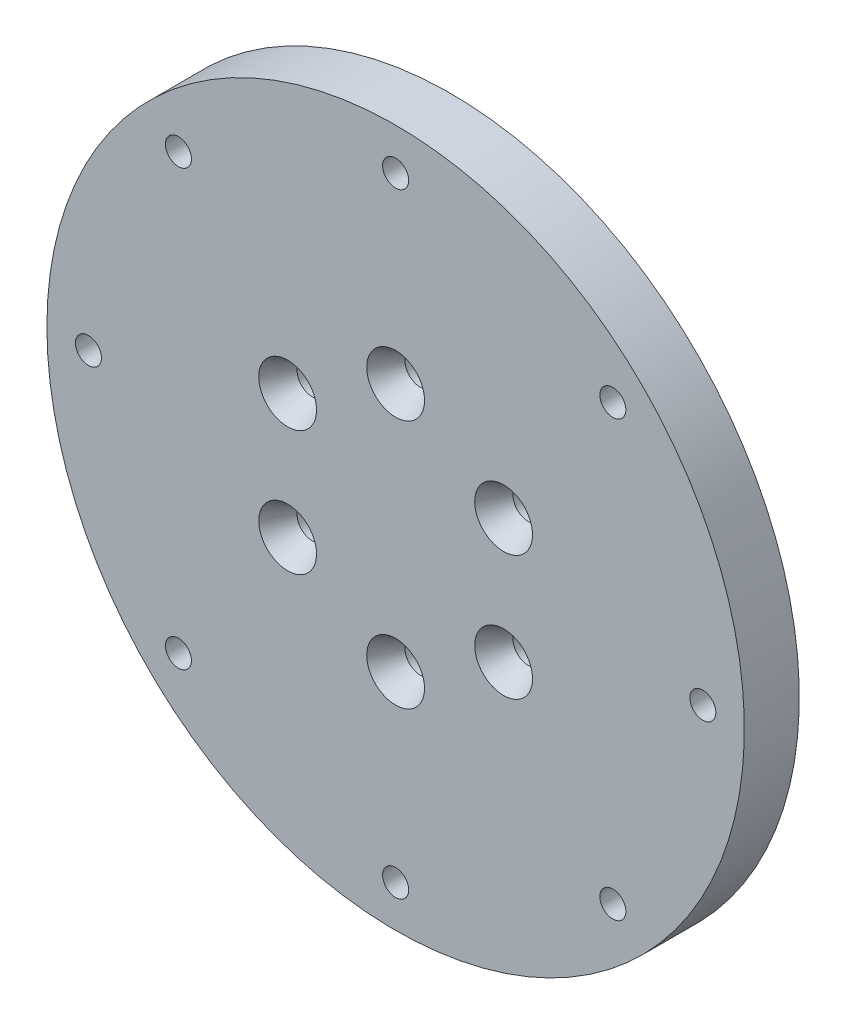
ISO-10303-21;
HEADER;
FILE_DESCRIPTION(('STEP AP214'),'2;1');
FILE_NAME('part.step','',(''),(''),'','','');
FILE_SCHEMA(('AUTOMOTIVE_DESIGN { 1 0 10303 214 1 1 1 1 }'));
ENDSEC;
DATA;
#1=APPLICATION_CONTEXT('core data for automotive mechanical design processes');
#2=APPLICATION_PROTOCOL_DEFINITION('international standard','automotive_design',2000,#1);
#3=PRODUCT_CONTEXT('',#1,'mechanical');
#4=PRODUCT('Part','Part','',(#3));
#5=PRODUCT_RELATED_PRODUCT_CATEGORY('part','',(#4));
#6=PRODUCT_DEFINITION_FORMATION('','',#4);
#7=PRODUCT_DEFINITION_CONTEXT('part definition',#1,'design');
#8=PRODUCT_DEFINITION('design','',#6,#7);
#9=PRODUCT_DEFINITION_SHAPE('','',#8);
#10=(LENGTH_UNIT() NAMED_UNIT(*) SI_UNIT(.MILLI.,.METRE.));
#11=(NAMED_UNIT(*) PLANE_ANGLE_UNIT() SI_UNIT($,.RADIAN.));
#12=(NAMED_UNIT(*) SI_UNIT($,.STERADIAN.) SOLID_ANGLE_UNIT());
#13=UNCERTAINTY_MEASURE_WITH_UNIT(LENGTH_MEASURE(1.E-05),#10,'distance_accuracy_value','');
#14=(GEOMETRIC_REPRESENTATION_CONTEXT(3) GLOBAL_UNCERTAINTY_ASSIGNED_CONTEXT((#13)) GLOBAL_UNIT_ASSIGNED_CONTEXT((#10,
#11,#12)) REPRESENTATION_CONTEXT('',''));
#15=CARTESIAN_POINT('',(0.,0.,0.));
#16=DIRECTION('',(0.,0.,1.));
#17=DIRECTION('',(1.,0.,0.));
#18=AXIS2_PLACEMENT_3D('',#15,#16,#17);
#19=CARTESIAN_POINT('',(0.,0.,12.));
#20=DIRECTION('',(0.,0.,-1.));
#21=DIRECTION('',(-1.,0.,0.));
#22=AXIS2_PLACEMENT_3D('',#19,#20,#21);
#23=CYLINDRICAL_SURFACE('',#22,29.5);
#24=CARTESIAN_POINT('',(0.,0.,7.));
#25=DIRECTION('',(0.,0.,1.));
#26=DIRECTION('',(1.,0.,0.));
#27=AXIS2_PLACEMENT_3D('',#24,#25,#26);
#28=CIRCLE('',#27,29.5);
#29=CARTESIAN_POINT('',(29.5,0.,7.));
#30=VERTEX_POINT('',#29);
#31=EDGE_CURVE('E10',#30,#30,#28,.F.);
#32=ORIENTED_EDGE('',*,*,#31,.T.);
#33=EDGE_LOOP('',(#32));
#34=FACE_BOUND('',#33,.T.);
#35=CARTESIAN_POINT('',(0.,0.,0.));
#36=DIRECTION('',(0.,0.,1.));
#37=DIRECTION('',(1.,0.,0.));
#38=AXIS2_PLACEMENT_3D('',#35,#36,#37);
#39=CIRCLE('',#38,29.5);
#40=CARTESIAN_POINT('',(29.5,0.,0.));
#41=VERTEX_POINT('',#40);
#42=EDGE_CURVE('E49',#41,#41,#39,.T.);
#43=ORIENTED_EDGE('',*,*,#42,.T.);
#44=EDGE_LOOP('',(#43));
#45=FACE_BOUND('',#44,.T.);
#46=ADVANCED_FACE('F36',(#34,#45),#23,.T.);
#47=CARTESIAN_POINT('',(0.,0.,0.));
#48=DIRECTION('',(0.,0.,1.));
#49=DIRECTION('',(1.,0.,0.));
#50=AXIS2_PLACEMENT_3D('',#47,#48,#49);
#51=PLANE('',#50);
#52=CARTESIAN_POINT('',(0.,17.25,0.));
#53=DIRECTION('',(0.,0.,1.));
#54=DIRECTION('',(1.,0.,0.));
#55=AXIS2_PLACEMENT_3D('',#52,#53,#54);
#56=CIRCLE('',#55,2.1);
#57=CARTESIAN_POINT('',(2.1,17.25,0.));
#58=VERTEX_POINT('',#57);
#59=EDGE_CURVE('E135',#58,#58,#56,.T.);
#60=ORIENTED_EDGE('',*,*,#59,.T.);
#61=EDGE_LOOP('',(#60));
#62=FACE_BOUND('',#61,.T.);
#63=CARTESIAN_POINT('',(14.9389382152816,8.62499999999997,0.));
#64=DIRECTION('',(0.,0.,1.));
#65=DIRECTION('',(1.,0.,0.));
#66=AXIS2_PLACEMENT_3D('',#63,#64,#65);
#67=CIRCLE('',#66,2.1);
#68=CARTESIAN_POINT('',(17.0389382152816,8.62499999999997,0.));
#69=VERTEX_POINT('',#68);
#70=EDGE_CURVE('E132',#69,#69,#67,.T.);
#71=ORIENTED_EDGE('',*,*,#70,.T.);
#72=EDGE_LOOP('',(#71));
#73=FACE_BOUND('',#72,.T.);
#74=CARTESIAN_POINT('',(14.9389382152815,-8.62500000000007,0.));
#75=DIRECTION('',(0.,0.,1.));
#76=DIRECTION('',(1.,0.,0.));
#77=AXIS2_PLACEMENT_3D('',#74,#75,#76);
#78=CIRCLE('',#77,2.1);
#79=CARTESIAN_POINT('',(17.0389382152815,-8.62500000000007,0.));
#80=VERTEX_POINT('',#79);
#81=EDGE_CURVE('E129',#80,#80,#78,.T.);
#82=ORIENTED_EDGE('',*,*,#81,.T.);
#83=EDGE_LOOP('',(#82));
#84=FACE_BOUND('',#83,.T.);
#85=CARTESIAN_POINT('',(-1.20456106190088E-13,-17.25,0.));
#86=DIRECTION('',(0.,0.,1.));
#87=DIRECTION('',(1.,0.,0.));
#88=AXIS2_PLACEMENT_3D('',#85,#86,#87);
#89=CIRCLE('',#88,2.1);
#90=CARTESIAN_POINT('',(2.09999999999988,-17.25,0.));
#91=VERTEX_POINT('',#90);
#92=EDGE_CURVE('E126',#91,#91,#89,.T.);
#93=ORIENTED_EDGE('',*,*,#92,.T.);
#94=EDGE_LOOP('',(#93));
#95=FACE_BOUND('',#94,.T.);
#96=CARTESIAN_POINT('',(-14.9389382152816,-8.62499999999986,0.));
#97=DIRECTION('',(0.,0.,1.));
#98=DIRECTION('',(1.,0.,0.));
#99=AXIS2_PLACEMENT_3D('',#96,#97,#98);
#100=CIRCLE('',#99,2.1);
#101=CARTESIAN_POINT('',(-12.8389382152816,-8.62499999999986,0.));
#102=VERTEX_POINT('',#101);
#103=EDGE_CURVE('E123',#102,#102,#100,.T.);
#104=ORIENTED_EDGE('',*,*,#103,.T.);
#105=EDGE_LOOP('',(#104));
#106=FACE_BOUND('',#105,.T.);
#107=CARTESIAN_POINT('',(-14.9389382152815,8.62500000000018,0.));
#108=DIRECTION('',(0.,0.,1.));
#109=DIRECTION('',(1.,0.,0.));
#110=AXIS2_PLACEMENT_3D('',#107,#108,#109);
#111=CIRCLE('',#110,2.1);
#112=CARTESIAN_POINT('',(-12.8389382152815,8.62500000000018,0.));
#113=VERTEX_POINT('',#112);
#114=EDGE_CURVE('E120',#113,#113,#111,.T.);
#115=ORIENTED_EDGE('',*,*,#114,.T.);
#116=EDGE_LOOP('',(#115));
#117=FACE_BOUND('',#116,.T.);
#118=ORIENTED_EDGE('',*,*,#42,.F.);
#119=EDGE_LOOP('',(#118));
#120=FACE_BOUND('',#119,.T.);
#121=ADVANCED_FACE('F195',(#62,#73,#84,#95,#106,#117,#120),#51,.F.);
#122=CARTESIAN_POINT('',(0.,0.,19.6));
#123=DIRECTION('',(0.,0.,-1.));
#124=DIRECTION('',(-1.,0.,0.));
#125=AXIS2_PLACEMENT_3D('',#122,#123,#124);
#126=CYLINDRICAL_SURFACE('',#125,48.25);
#127=CARTESIAN_POINT('',(0.,0.,19.6));
#128=DIRECTION('',(0.,0.,1.));
#129=DIRECTION('',(1.,0.,0.));
#130=AXIS2_PLACEMENT_3D('',#127,#128,#129);
#131=CIRCLE('',#130,48.25);
#132=CARTESIAN_POINT('',(-48.25,0.,19.6));
#133=VERTEX_POINT('',#132);
#134=EDGE_CURVE('E187',#133,#133,#131,.T.);
#135=CARTESIAN_POINT('',(0.,0.,12.));
#136=DIRECTION('',(0.,0.,1.));
#137=DIRECTION('',(1.,0.,0.));
#138=AXIS2_PLACEMENT_3D('',#135,#136,#137);
#139=CIRCLE('',#138,48.25);
#140=CARTESIAN_POINT('',(-48.25,0.,12.));
#141=VERTEX_POINT('',#140);
#142=EDGE_CURVE('E142',#141,#141,#139,.T.);
#143=CARTESIAN_POINT('',(-48.25,0.,19.6));
#144=CARTESIAN_POINT('',(-48.25,0.,19.5208333333333));
#145=CARTESIAN_POINT('',(-48.25,0.,19.4416666666667));
#146=CARTESIAN_POINT('',(-48.25,0.,19.2833333333333));
#147=CARTESIAN_POINT('',(-48.25,0.,19.2041666666667));
#148=CARTESIAN_POINT('',(-48.25,0.,19.0458333333333));
#149=CARTESIAN_POINT('',(-48.25,0.,18.9666666666667));
#150=CARTESIAN_POINT('',(-48.25,0.,18.8083333333333));
#151=CARTESIAN_POINT('',(-48.25,0.,18.7291666666667));
#152=CARTESIAN_POINT('',(-48.25,0.,18.5708333333333));
#153=CARTESIAN_POINT('',(-48.25,0.,18.4916666666667));
#154=CARTESIAN_POINT('',(-48.25,0.,18.3333333333333));
#155=CARTESIAN_POINT('',(-48.25,0.,18.2541666666667));
#156=CARTESIAN_POINT('',(-48.25,0.,18.0958333333333));
#157=CARTESIAN_POINT('',(-48.25,0.,18.0166666666667));
#158=CARTESIAN_POINT('',(-48.25,0.,17.8583333333333));
#159=CARTESIAN_POINT('',(-48.25,0.,17.7791666666667));
#160=CARTESIAN_POINT('',(-48.25,0.,17.6208333333333));
#161=CARTESIAN_POINT('',(-48.25,0.,17.5416666666667));
#162=CARTESIAN_POINT('',(-48.25,0.,17.3833333333333));
#163=CARTESIAN_POINT('',(-48.25,0.,17.3041666666667));
#164=CARTESIAN_POINT('',(-48.25,0.,17.1458333333333));
#165=CARTESIAN_POINT('',(-48.25,0.,17.0666666666667));
#166=CARTESIAN_POINT('',(-48.25,0.,16.9083333333333));
#167=CARTESIAN_POINT('',(-48.25,0.,16.8291666666667));
#168=CARTESIAN_POINT('',(-48.25,0.,16.6708333333333));
#169=CARTESIAN_POINT('',(-48.25,0.,16.5916666666667));
#170=CARTESIAN_POINT('',(-48.25,0.,16.4333333333333));
#171=CARTESIAN_POINT('',(-48.25,0.,16.3541666666667));
#172=CARTESIAN_POINT('',(-48.25,0.,16.1958333333333));
#173=CARTESIAN_POINT('',(-48.25,0.,16.1166666666667));
#174=CARTESIAN_POINT('',(-48.25,0.,15.9583333333333));
#175=CARTESIAN_POINT('',(-48.25,0.,15.8791666666667));
#176=CARTESIAN_POINT('',(-48.25,0.,15.7208333333333));
#177=CARTESIAN_POINT('',(-48.25,0.,15.6416666666667));
#178=CARTESIAN_POINT('',(-48.25,0.,15.4833333333333));
#179=CARTESIAN_POINT('',(-48.25,0.,15.4041666666667));
#180=CARTESIAN_POINT('',(-48.25,0.,15.2458333333333));
#181=CARTESIAN_POINT('',(-48.25,0.,15.1666666666667));
#182=CARTESIAN_POINT('',(-48.25,0.,15.0083333333333));
#183=CARTESIAN_POINT('',(-48.25,0.,14.9291666666667));
#184=CARTESIAN_POINT('',(-48.25,0.,14.7708333333333));
#185=CARTESIAN_POINT('',(-48.25,0.,14.6916666666667));
#186=CARTESIAN_POINT('',(-48.25,0.,14.5333333333333));
#187=CARTESIAN_POINT('',(-48.25,0.,14.4541666666667));
#188=CARTESIAN_POINT('',(-48.25,0.,14.2958333333333));
#189=CARTESIAN_POINT('',(-48.25,0.,14.2166666666667));
#190=CARTESIAN_POINT('',(-48.25,0.,14.0583333333333));
#191=CARTESIAN_POINT('',(-48.25,0.,13.9791666666667));
#192=CARTESIAN_POINT('',(-48.25,0.,13.8208333333333));
#193=CARTESIAN_POINT('',(-48.25,0.,13.7416666666667));
#194=CARTESIAN_POINT('',(-48.25,0.,13.5833333333333));
#195=CARTESIAN_POINT('',(-48.25,0.,13.5041666666667));
#196=CARTESIAN_POINT('',(-48.25,0.,13.3458333333333));
#197=CARTESIAN_POINT('',(-48.25,0.,13.2666666666667));
#198=CARTESIAN_POINT('',(-48.25,0.,13.1083333333333));
#199=CARTESIAN_POINT('',(-48.25,0.,13.0291666666667));
#200=CARTESIAN_POINT('',(-48.25,0.,12.8708333333333));
#201=CARTESIAN_POINT('',(-48.25,0.,12.7916666666667));
#202=CARTESIAN_POINT('',(-48.25,0.,12.6333333333333));
#203=CARTESIAN_POINT('',(-48.25,0.,12.5541666666667));
#204=CARTESIAN_POINT('',(-48.25,0.,12.3958333333333));
#205=CARTESIAN_POINT('',(-48.25,0.,12.3166666666667));
#206=CARTESIAN_POINT('',(-48.25,0.,12.1583333333333));
#207=CARTESIAN_POINT('',(-48.25,0.,12.0791666666667));
#208=CARTESIAN_POINT('',(-48.25,0.,12.));
#209=B_SPLINE_CURVE_WITH_KNOTS('',3,(#143,#144,#145,#146,#147,#148,#149,#150,#151,#152,#153,
#154,#155,#156,#157,#158,#159,#160,#161,#162,#163,#164,#165,#166,#167,#168,#169,#170,#171,#172,
#173,#174,#175,#176,#177,#178,#179,#180,#181,#182,#183,#184,#185,#186,#187,#188,#189,#190,#191,
#192,#193,#194,#195,#196,#197,#198,#199,#200,#201,#202,#203,#204,#205,#206,#207,#208),
.UNSPECIFIED.,.F.,.F.,(4,2,2,2,2,2,2,2,2,2,2,2,2,2,2,2,2,2,2,2,2,2,2,2,2,2,2,2,2,2,2,2,4),(0.,
0.237500000000002,0.475000000000003,0.712500000000001,0.950000000000003,1.1875,1.425,1.6625,1.9,
2.1375,2.375,2.6125,2.85,3.0875,3.325,3.5625,3.8,4.0375,4.275,4.5125,4.75,4.9875,5.225,5.4625,
5.7,5.9375,6.175,6.4125,6.65,6.8875,7.125,7.3625,7.6),.UNSPECIFIED.);
#210=EDGE_CURVE('BSEAM197',#133,#141,#209,.T.);
#211=ORIENTED_EDGE('',*,*,#134,.F.);
#212=ORIENTED_EDGE('',*,*,#142,.T.);
#213=ORIENTED_EDGE('',*,*,#210,.T.);
#214=ORIENTED_EDGE('',*,*,#210,.F.);
#215=EDGE_LOOP('',(#211,#213,#212,#214));
#216=FACE_BOUND('',#215,.T.);
#217=ADVANCED_FACE('F197',(#216),#126,.T.);
#218=CARTESIAN_POINT('',(0.,0.,19.6));
#219=DIRECTION('',(0.,0.,1.));
#220=DIRECTION('',(1.,0.,0.));
#221=AXIS2_PLACEMENT_3D('',#218,#219,#220);
#222=PLANE('',#221);
#223=CARTESIAN_POINT('',(0.,42.5,19.6));
#224=DIRECTION('',(0.,0.,1.));
#225=DIRECTION('',(1.,0.,0.));
#226=AXIS2_PLACEMENT_3D('',#223,#224,#225);
#227=CIRCLE('',#226,1.8);
#228=CARTESIAN_POINT('',(1.8,42.5,19.6));
#229=VERTEX_POINT('',#228);
#230=EDGE_CURVE('E40',#229,#229,#227,.T.);
#231=ORIENTED_EDGE('',*,*,#230,.F.);
#232=EDGE_LOOP('',(#231));
#233=FACE_BOUND('',#232,.T.);
#234=CARTESIAN_POINT('',(30.0520382004279,30.0520382004286,19.6));
#235=DIRECTION('',(0.,0.,1.));
#236=DIRECTION('',(1.,0.,0.));
#237=AXIS2_PLACEMENT_3D('',#234,#235,#236);
#238=CIRCLE('',#237,1.8);
#239=CARTESIAN_POINT('',(31.8520382004279,30.0520382004286,19.6));
#240=VERTEX_POINT('',#239);
#241=EDGE_CURVE('E71',#240,#240,#238,.T.);
#242=ORIENTED_EDGE('',*,*,#241,.F.);
#243=EDGE_LOOP('',(#242));
#244=FACE_BOUND('',#243,.T.);
#245=CARTESIAN_POINT('',(42.5,4.451638707025E-13,19.6));
#246=DIRECTION('',(0.,0.,1.));
#247=DIRECTION('',(1.,0.,0.));
#248=AXIS2_PLACEMENT_3D('',#245,#246,#247);
#249=CIRCLE('',#248,1.8);
#250=CARTESIAN_POINT('',(44.3,4.451638707025E-13,19.6));
#251=VERTEX_POINT('',#250);
#252=EDGE_CURVE('E69',#251,#251,#249,.T.);
#253=ORIENTED_EDGE('',*,*,#252,.F.);
#254=EDGE_LOOP('',(#253));
#255=FACE_BOUND('',#254,.T.);
#256=CARTESIAN_POINT('',(30.0520382004285,-30.052038200428,19.6));
#257=DIRECTION('',(0.,0.,1.));
#258=DIRECTION('',(1.,0.,0.));
#259=AXIS2_PLACEMENT_3D('',#256,#257,#258);
#260=CIRCLE('',#259,1.8);
#261=CARTESIAN_POINT('',(31.8520382004285,-30.052038200428,19.6));
#262=VERTEX_POINT('',#261);
#263=EDGE_CURVE('E66',#262,#262,#260,.T.);
#264=ORIENTED_EDGE('',*,*,#263,.F.);
#265=EDGE_LOOP('',(#264));
#266=FACE_BOUND('',#265,.T.);
#267=CARTESIAN_POINT('',(2.96775913801666E-13,-42.5,19.6));
#268=DIRECTION('',(0.,0.,1.));
#269=DIRECTION('',(1.,0.,0.));
#270=AXIS2_PLACEMENT_3D('',#267,#268,#269);
#271=CIRCLE('',#270,1.8);
#272=CARTESIAN_POINT('',(1.8000000000003,-42.5,19.6));
#273=VERTEX_POINT('',#272);
#274=EDGE_CURVE('E63',#273,#273,#271,.T.);
#275=ORIENTED_EDGE('',*,*,#274,.F.);
#276=EDGE_LOOP('',(#275));
#277=FACE_BOUND('',#276,.T.);
#278=CARTESIAN_POINT('',(-30.0520382004281,-30.0520382004284,19.6));
#279=DIRECTION('',(0.,0.,1.));
#280=DIRECTION('',(1.,0.,0.));
#281=AXIS2_PLACEMENT_3D('',#278,#279,#280);
#282=CIRCLE('',#281,1.8);
#283=CARTESIAN_POINT('',(-28.2520382004281,-30.0520382004284,19.6));
#284=VERTEX_POINT('',#283);
#285=EDGE_CURVE('E60',#284,#284,#282,.T.);
#286=ORIENTED_EDGE('',*,*,#285,.F.);
#287=EDGE_LOOP('',(#286));
#288=FACE_BOUND('',#287,.T.);
#289=CARTESIAN_POINT('',(-42.5,-1.48387956900833E-13,19.6));
#290=DIRECTION('',(0.,0.,1.));
#291=DIRECTION('',(1.,0.,0.));
#292=AXIS2_PLACEMENT_3D('',#289,#290,#291);
#293=CIRCLE('',#292,1.8);
#294=CARTESIAN_POINT('',(-40.7,-1.48387956900833E-13,19.6));
#295=VERTEX_POINT('',#294);
#296=EDGE_CURVE('E56',#295,#295,#293,.T.);
#297=ORIENTED_EDGE('',*,*,#296,.F.);
#298=EDGE_LOOP('',(#297));
#299=FACE_BOUND('',#298,.T.);
#300=CARTESIAN_POINT('',(-30.0520382004283,30.0520382004282,19.6));
#301=DIRECTION('',(0.,0.,1.));
#302=DIRECTION('',(1.,0.,0.));
#303=AXIS2_PLACEMENT_3D('',#300,#301,#302);
#304=CIRCLE('',#303,1.8);
#305=CARTESIAN_POINT('',(-28.2520382004283,30.0520382004282,19.6));
#306=VERTEX_POINT('',#305);
#307=EDGE_CURVE('E53',#306,#306,#304,.T.);
#308=ORIENTED_EDGE('',*,*,#307,.F.);
#309=EDGE_LOOP('',(#308));
#310=FACE_BOUND('',#309,.T.);
#311=CARTESIAN_POINT('',(14.9389382152816,-8.62499999999985,19.6));
#312=DIRECTION('',(0.,0.,-1.));
#313=DIRECTION('',(-0.50000000000001,0.866025403784433,0.));
#314=AXIS2_PLACEMENT_3D('',#311,#312,#313);
#315=CIRCLE('',#314,4.);
#316=CARTESIAN_POINT('',(12.9389382152816,-5.16089838486213,19.6));
#317=VERTEX_POINT('',#316);
#318=EDGE_CURVE('E76',#317,#317,#315,.T.);
#319=ORIENTED_EDGE('',*,*,#318,.T.);
#320=EDGE_LOOP('',(#319));
#321=FACE_BOUND('',#320,.T.);
#322=CARTESIAN_POINT('',(1.24032728532342E-13,-17.25,19.6));
#323=DIRECTION('',(0.,0.,-1.));
#324=DIRECTION('',(0.499999999999992,0.866025403784443,0.));
#325=AXIS2_PLACEMENT_3D('',#322,#323,#324);
#326=CIRCLE('',#325,4.);
#327=CARTESIAN_POINT('',(2.00000000000009,-13.7858983848622,19.6));
#328=VERTEX_POINT('',#327);
#329=EDGE_CURVE('E85',#328,#328,#326,.T.);
#330=ORIENTED_EDGE('',*,*,#329,.T.);
#331=EDGE_LOOP('',(#330));
#332=FACE_BOUND('',#331,.T.);
#333=CARTESIAN_POINT('',(-14.9389382152816,-8.62499999999997,19.6));
#334=DIRECTION('',(0.,0.,-1.));
#335=DIRECTION('',(1.,0.,0.));
#336=AXIS2_PLACEMENT_3D('',#333,#334,#335);
#337=CIRCLE('',#336,4.);
#338=CARTESIAN_POINT('',(-10.9389382152816,-8.62499999999997,19.6));
#339=VERTEX_POINT('',#338);
#340=EDGE_CURVE('E96',#339,#339,#337,.T.);
#341=ORIENTED_EDGE('',*,*,#340,.T.);
#342=EDGE_LOOP('',(#341));
#343=FACE_BOUND('',#342,.T.);
#344=CARTESIAN_POINT('',(-14.9389382152816,8.62499999999996,19.6));
#345=DIRECTION('',(0.,0.,-1.));
#346=DIRECTION('',(0.500000000000004,-0.866025403784436,0.));
#347=AXIS2_PLACEMENT_3D('',#344,#345,#346);
#348=CIRCLE('',#347,4.);
#349=CARTESIAN_POINT('',(-12.9389382152816,5.16089838486222,19.6));
#350=VERTEX_POINT('',#349);
#351=EDGE_CURVE('E102',#350,#350,#348,.T.);
#352=ORIENTED_EDGE('',*,*,#351,.T.);
#353=EDGE_LOOP('',(#352));
#354=FACE_BOUND('',#353,.T.);
#355=CARTESIAN_POINT('',(0.,17.25,19.6));
#356=DIRECTION('',(0.,0.,-1.));
#357=DIRECTION('',(-0.499999999999998,-0.86602540378444,0.));
#358=AXIS2_PLACEMENT_3D('',#355,#356,#357);
#359=CIRCLE('',#358,4.);
#360=CARTESIAN_POINT('',(-1.99999999999999,13.7858983848622,19.6));
#361=VERTEX_POINT('',#360);
#362=EDGE_CURVE('E108',#361,#361,#359,.T.);
#363=ORIENTED_EDGE('',*,*,#362,.T.);
#364=EDGE_LOOP('',(#363));
#365=FACE_BOUND('',#364,.T.);
#366=CARTESIAN_POINT('',(14.9389382152816,8.62499999999997,19.6));
#367=DIRECTION('',(0.,0.,-1.));
#368=DIRECTION('',(-1.,0.,0.));
#369=AXIS2_PLACEMENT_3D('',#366,#367,#368);
#370=CIRCLE('',#369,4.);
#371=CARTESIAN_POINT('',(10.9389382152816,8.62499999999997,19.6));
#372=VERTEX_POINT('',#371);
#373=EDGE_CURVE('E114',#372,#372,#370,.T.);
#374=ORIENTED_EDGE('',*,*,#373,.T.);
#375=EDGE_LOOP('',(#374));
#376=FACE_BOUND('',#375,.T.);
#377=ORIENTED_EDGE('',*,*,#134,.T.);
#378=EDGE_LOOP('',(#377));
#379=FACE_BOUND('',#378,.T.);
#380=ADVANCED_FACE('F204',(#233,#244,#255,#266,#277,#288,#299,#310,#321,#332,#343,#354,#365,
#376,#379),#222,.T.);
#381=CARTESIAN_POINT('',(0.,0.,12.));
#382=DIRECTION('',(0.,0.,1.));
#383=DIRECTION('',(1.,0.,0.));
#384=AXIS2_PLACEMENT_3D('',#381,#382,#383);
#385=PLANE('',#384);
#386=CARTESIAN_POINT('',(0.,42.5,12.));
#387=DIRECTION('',(0.,0.,-1.));
#388=DIRECTION('',(-1.,0.,0.));
#389=AXIS2_PLACEMENT_3D('',#386,#387,#388);
#390=CIRCLE('',#389,3.);
#391=CARTESIAN_POINT('',(-3.,42.5,12.));
#392=VERTEX_POINT('',#391);
#393=EDGE_CURVE('E143',#392,#392,#390,.T.);
#394=ORIENTED_EDGE('',*,*,#393,.F.);
#395=EDGE_LOOP('',(#394));
#396=FACE_BOUND('',#395,.T.);
#397=CARTESIAN_POINT('',(-30.0520382004283,30.0520382004282,12.));
#398=DIRECTION('',(0.,0.,-1.));
#399=DIRECTION('',(-1.,0.,0.));
#400=AXIS2_PLACEMENT_3D('',#397,#398,#399);
#401=CIRCLE('',#400,3.);
#402=CARTESIAN_POINT('',(-33.0520382004283,30.0520382004282,12.));
#403=VERTEX_POINT('',#402);
#404=EDGE_CURVE('E146',#403,#403,#401,.T.);
#405=ORIENTED_EDGE('',*,*,#404,.F.);
#406=EDGE_LOOP('',(#405));
#407=FACE_BOUND('',#406,.T.);
#408=CARTESIAN_POINT('',(-42.5,-1.48387956900833E-13,12.));
#409=DIRECTION('',(0.,0.,-1.));
#410=DIRECTION('',(-1.,0.,0.));
#411=AXIS2_PLACEMENT_3D('',#408,#409,#410);
#412=CIRCLE('',#411,3.);
#413=CARTESIAN_POINT('',(-45.5,-1.48387956900833E-13,12.));
#414=VERTEX_POINT('',#413);
#415=EDGE_CURVE('E152',#414,#414,#412,.T.);
#416=ORIENTED_EDGE('',*,*,#415,.F.);
#417=EDGE_LOOP('',(#416));
#418=FACE_BOUND('',#417,.T.);
#419=CARTESIAN_POINT('',(-30.0520382004281,-30.0520382004284,12.));
#420=DIRECTION('',(0.,0.,-1.));
#421=DIRECTION('',(-1.,0.,0.));
#422=AXIS2_PLACEMENT_3D('',#419,#420,#421);
#423=CIRCLE('',#422,3.);
#424=CARTESIAN_POINT('',(-33.0520382004281,-30.0520382004284,12.));
#425=VERTEX_POINT('',#424);
#426=EDGE_CURVE('E158',#425,#425,#423,.T.);
#427=ORIENTED_EDGE('',*,*,#426,.F.);
#428=EDGE_LOOP('',(#427));
#429=FACE_BOUND('',#428,.T.);
#430=CARTESIAN_POINT('',(2.96775913801666E-13,-42.5,12.));
#431=DIRECTION('',(0.,0.,-1.));
#432=DIRECTION('',(-1.,0.,0.));
#433=AXIS2_PLACEMENT_3D('',#430,#431,#432);
#434=CIRCLE('',#433,3.);
#435=CARTESIAN_POINT('',(-2.9999999999997,-42.5,12.));
#436=VERTEX_POINT('',#435);
#437=EDGE_CURVE('E164',#436,#436,#434,.T.);
#438=ORIENTED_EDGE('',*,*,#437,.F.);
#439=EDGE_LOOP('',(#438));
#440=FACE_BOUND('',#439,.T.);
#441=CARTESIAN_POINT('',(30.0520382004285,-30.052038200428,12.));
#442=DIRECTION('',(0.,0.,-1.));
#443=DIRECTION('',(-1.,0.,0.));
#444=AXIS2_PLACEMENT_3D('',#441,#442,#443);
#445=CIRCLE('',#444,3.);
#446=CARTESIAN_POINT('',(27.0520382004285,-30.052038200428,12.));
#447=VERTEX_POINT('',#446);
#448=EDGE_CURVE('E170',#447,#447,#445,.T.);
#449=ORIENTED_EDGE('',*,*,#448,.F.);
#450=EDGE_LOOP('',(#449));
#451=FACE_BOUND('',#450,.T.);
#452=CARTESIAN_POINT('',(42.5,4.451638707025E-13,12.));
#453=DIRECTION('',(0.,0.,-1.));
#454=DIRECTION('',(-1.,0.,0.));
#455=AXIS2_PLACEMENT_3D('',#452,#453,#454);
#456=CIRCLE('',#455,3.);
#457=CARTESIAN_POINT('',(39.5,4.451638707025E-13,12.));
#458=VERTEX_POINT('',#457);
#459=EDGE_CURVE('E176',#458,#458,#456,.T.);
#460=ORIENTED_EDGE('',*,*,#459,.F.);
#461=EDGE_LOOP('',(#460));
#462=FACE_BOUND('',#461,.T.);
#463=CARTESIAN_POINT('',(30.0520382004279,30.0520382004286,12.));
#464=DIRECTION('',(0.,0.,-1.));
#465=DIRECTION('',(-1.,0.,0.));
#466=AXIS2_PLACEMENT_3D('',#463,#464,#465);
#467=CIRCLE('',#466,3.);
#468=CARTESIAN_POINT('',(27.0520382004279,30.0520382004286,12.));
#469=VERTEX_POINT('',#468);
#470=EDGE_CURVE('E182',#469,#469,#467,.T.);
#471=ORIENTED_EDGE('',*,*,#470,.F.);
#472=EDGE_LOOP('',(#471));
#473=FACE_BOUND('',#472,.T.);
#474=CARTESIAN_POINT('',(0.,0.,12.));
#475=DIRECTION('',(0.,0.,1.));
#476=DIRECTION('',(1.,0.,0.));
#477=AXIS2_PLACEMENT_3D('',#474,#475,#476);
#478=CIRCLE('',#477,34.5);
#479=CARTESIAN_POINT('',(34.5,0.,12.));
#480=VERTEX_POINT('',#479);
#481=EDGE_CURVE('E44',#480,#480,#478,.T.);
#482=ORIENTED_EDGE('',*,*,#481,.T.);
#483=EDGE_LOOP('',(#482));
#484=FACE_BOUND('',#483,.T.);
#485=ORIENTED_EDGE('',*,*,#142,.F.);
#486=EDGE_LOOP('',(#485));
#487=FACE_BOUND('',#486,.T.);
#488=ADVANCED_FACE('F209',(#396,#407,#418,#429,#440,#451,#462,#473,#484,#487),#385,.F.);
#489=CARTESIAN_POINT('',(0.,0.,7.));
#490=DIRECTION('',(0.,0.,1.));
#491=DIRECTION('',(1.,0.,0.));
#492=AXIS2_PLACEMENT_3D('',#489,#490,#491);
#493=TOROIDAL_SURFACE('',#492,34.5,5.);
#494=ORIENTED_EDGE('',*,*,#31,.F.);
#495=EDGE_LOOP('',(#494));
#496=FACE_BOUND('',#495,.T.);
#497=ORIENTED_EDGE('',*,*,#481,.F.);
#498=EDGE_LOOP('',(#497));
#499=FACE_BOUND('',#498,.T.);
#500=ADVANCED_FACE('F38',(#496,#499),#493,.F.);
#501=CARTESIAN_POINT('',(30.0520382004279,30.0520382004286,15.6));
#502=DIRECTION('',(0.,0.,-1.));
#503=DIRECTION('',(-1.,0.,0.));
#504=AXIS2_PLACEMENT_3D('',#501,#502,#503);
#505=CYLINDRICAL_SURFACE('',#504,3.);
#506=CARTESIAN_POINT('',(30.0520382004279,30.0520382004286,15.6));
#507=DIRECTION('',(0.,0.,-1.));
#508=DIRECTION('',(-1.,0.,0.));
#509=AXIS2_PLACEMENT_3D('',#506,#507,#508);
#510=CIRCLE('',#509,3.);
#511=CARTESIAN_POINT('',(27.0520382004279,30.0520382004286,15.6));
#512=VERTEX_POINT('',#511);
#513=EDGE_CURVE('E138',#512,#512,#510,.T.);
#514=ORIENTED_EDGE('',*,*,#513,.F.);
#515=EDGE_LOOP('',(#514));
#516=FACE_BOUND('',#515,.T.);
#517=ORIENTED_EDGE('',*,*,#470,.T.);
#518=EDGE_LOOP('',(#517));
#519=FACE_BOUND('',#518,.T.);
#520=ADVANCED_FACE('F220',(#516,#519),#505,.F.);
#521=CARTESIAN_POINT('',(30.0520382004279,30.0520382004286,15.6));
#522=DIRECTION('',(0.,0.,-1.));
#523=DIRECTION('',(-1.,0.,0.));
#524=AXIS2_PLACEMENT_3D('',#521,#522,#523);
#525=PLANE('',#524);
#526=CARTESIAN_POINT('',(30.0520382004279,30.0520382004286,15.6));
#527=DIRECTION('',(0.,0.,-1.));
#528=DIRECTION('',(-1.,0.,0.));
#529=AXIS2_PLACEMENT_3D('',#526,#527,#528);
#530=CIRCLE('',#529,1.8);
#531=CARTESIAN_POINT('',(28.2520382004279,30.0520382004286,15.6));
#532=VERTEX_POINT('',#531);
#533=EDGE_CURVE('E362',#532,#532,#530,.T.);
#534=ORIENTED_EDGE('',*,*,#533,.F.);
#535=EDGE_LOOP('',(#534));
#536=FACE_BOUND('',#535,.T.);
#537=ORIENTED_EDGE('',*,*,#513,.T.);
#538=EDGE_LOOP('',(#537));
#539=FACE_BOUND('',#538,.T.);
#540=ADVANCED_FACE('F216',(#536,#539),#525,.T.);
#541=CARTESIAN_POINT('',(42.5,4.451638707025E-13,15.6));
#542=DIRECTION('',(0.,0.,-1.));
#543=DIRECTION('',(-1.,0.,0.));
#544=AXIS2_PLACEMENT_3D('',#541,#542,#543);
#545=CYLINDRICAL_SURFACE('',#544,3.);
#546=CARTESIAN_POINT('',(42.5,4.451638707025E-13,15.6));
#547=DIRECTION('',(0.,0.,-1.));
#548=DIRECTION('',(-1.,0.,0.));
#549=AXIS2_PLACEMENT_3D('',#546,#547,#548);
#550=CIRCLE('',#549,3.);
#551=CARTESIAN_POINT('',(39.5,4.451638707025E-13,15.6));
#552=VERTEX_POINT('',#551);
#553=EDGE_CURVE('E179',#552,#552,#550,.T.);
#554=ORIENTED_EDGE('',*,*,#553,.F.);
#555=EDGE_LOOP('',(#554));
#556=FACE_BOUND('',#555,.T.);
#557=ORIENTED_EDGE('',*,*,#459,.T.);
#558=EDGE_LOOP('',(#557));
#559=FACE_BOUND('',#558,.T.);
#560=ADVANCED_FACE('F219',(#556,#559),#545,.F.);
#561=CARTESIAN_POINT('',(42.5,4.451638707025E-13,15.6));
#562=DIRECTION('',(0.,0.,-1.));
#563=DIRECTION('',(-1.,0.,0.));
#564=AXIS2_PLACEMENT_3D('',#561,#562,#563);
#565=PLANE('',#564);
#566=CARTESIAN_POINT('',(42.5,4.451638707025E-13,15.6));
#567=DIRECTION('',(0.,0.,-1.));
#568=DIRECTION('',(-1.,0.,0.));
#569=AXIS2_PLACEMENT_3D('',#566,#567,#568);
#570=CIRCLE('',#569,1.8);
#571=CARTESIAN_POINT('',(40.7,4.451638707025E-13,15.6));
#572=VERTEX_POINT('',#571);
#573=EDGE_CURVE('E365',#572,#572,#570,.T.);
#574=ORIENTED_EDGE('',*,*,#573,.F.);
#575=EDGE_LOOP('',(#574));
#576=FACE_BOUND('',#575,.T.);
#577=ORIENTED_EDGE('',*,*,#553,.T.);
#578=EDGE_LOOP('',(#577));
#579=FACE_BOUND('',#578,.T.);
#580=ADVANCED_FACE('F225',(#576,#579),#565,.T.);
#581=CARTESIAN_POINT('',(30.0520382004285,-30.052038200428,15.6));
#582=DIRECTION('',(0.,0.,-1.));
#583=DIRECTION('',(-1.,0.,0.));
#584=AXIS2_PLACEMENT_3D('',#581,#582,#583);
#585=CYLINDRICAL_SURFACE('',#584,3.);
#586=CARTESIAN_POINT('',(30.0520382004285,-30.052038200428,15.6));
#587=DIRECTION('',(0.,0.,-1.));
#588=DIRECTION('',(-1.,0.,0.));
#589=AXIS2_PLACEMENT_3D('',#586,#587,#588);
#590=CIRCLE('',#589,3.);
#591=CARTESIAN_POINT('',(27.0520382004285,-30.052038200428,15.6));
#592=VERTEX_POINT('',#591);
#593=EDGE_CURVE('E173',#592,#592,#590,.T.);
#594=ORIENTED_EDGE('',*,*,#593,.F.);
#595=EDGE_LOOP('',(#594));
#596=FACE_BOUND('',#595,.T.);
#597=ORIENTED_EDGE('',*,*,#448,.T.);
#598=EDGE_LOOP('',(#597));
#599=FACE_BOUND('',#598,.T.);
#600=ADVANCED_FACE('F228',(#596,#599),#585,.F.);
#601=CARTESIAN_POINT('',(30.0520382004285,-30.052038200428,15.6));
#602=DIRECTION('',(0.,0.,-1.));
#603=DIRECTION('',(-1.,0.,0.));
#604=AXIS2_PLACEMENT_3D('',#601,#602,#603);
#605=PLANE('',#604);
#606=CARTESIAN_POINT('',(30.0520382004285,-30.052038200428,15.6));
#607=DIRECTION('',(0.,0.,-1.));
#608=DIRECTION('',(-1.,0.,0.));
#609=AXIS2_PLACEMENT_3D('',#606,#607,#608);
#610=CIRCLE('',#609,1.8);
#611=CARTESIAN_POINT('',(28.2520382004285,-30.052038200428,15.6));
#612=VERTEX_POINT('',#611);
#613=EDGE_CURVE('E370',#612,#612,#610,.T.);
#614=ORIENTED_EDGE('',*,*,#613,.F.);
#615=EDGE_LOOP('',(#614));
#616=FACE_BOUND('',#615,.T.);
#617=ORIENTED_EDGE('',*,*,#593,.T.);
#618=EDGE_LOOP('',(#617));
#619=FACE_BOUND('',#618,.T.);
#620=ADVANCED_FACE('F233',(#616,#619),#605,.T.);
#621=CARTESIAN_POINT('',(2.96775913801666E-13,-42.5,15.6));
#622=DIRECTION('',(0.,0.,-1.));
#623=DIRECTION('',(-1.,0.,0.));
#624=AXIS2_PLACEMENT_3D('',#621,#622,#623);
#625=CYLINDRICAL_SURFACE('',#624,3.);
#626=CARTESIAN_POINT('',(2.96775913801666E-13,-42.5,15.6));
#627=DIRECTION('',(0.,0.,-1.));
#628=DIRECTION('',(-1.,0.,0.));
#629=AXIS2_PLACEMENT_3D('',#626,#627,#628);
#630=CIRCLE('',#629,3.);
#631=CARTESIAN_POINT('',(-2.9999999999997,-42.5,15.6));
#632=VERTEX_POINT('',#631);
#633=EDGE_CURVE('E167',#632,#632,#630,.T.);
#634=ORIENTED_EDGE('',*,*,#633,.F.);
#635=EDGE_LOOP('',(#634));
#636=FACE_BOUND('',#635,.T.);
#637=ORIENTED_EDGE('',*,*,#437,.T.);
#638=EDGE_LOOP('',(#637));
#639=FACE_BOUND('',#638,.T.);
#640=ADVANCED_FACE('F236',(#636,#639),#625,.F.);
#641=CARTESIAN_POINT('',(2.96775913801666E-13,-42.5,15.6));
#642=DIRECTION('',(0.,0.,-1.));
#643=DIRECTION('',(-1.,0.,0.));
#644=AXIS2_PLACEMENT_3D('',#641,#642,#643);
#645=PLANE('',#644);
#646=CARTESIAN_POINT('',(2.96775913801666E-13,-42.5,15.6));
#647=DIRECTION('',(0.,0.,-1.));
#648=DIRECTION('',(-1.,0.,0.));
#649=AXIS2_PLACEMENT_3D('',#646,#647,#648);
#650=CIRCLE('',#649,1.8);
#651=CARTESIAN_POINT('',(-1.7999999999997,-42.5,15.6));
#652=VERTEX_POINT('',#651);
#653=EDGE_CURVE('E373',#652,#652,#650,.T.);
#654=ORIENTED_EDGE('',*,*,#653,.F.);
#655=EDGE_LOOP('',(#654));
#656=FACE_BOUND('',#655,.T.);
#657=ORIENTED_EDGE('',*,*,#633,.T.);
#658=EDGE_LOOP('',(#657));
#659=FACE_BOUND('',#658,.T.);
#660=ADVANCED_FACE('F241',(#656,#659),#645,.T.);
#661=CARTESIAN_POINT('',(-30.0520382004281,-30.0520382004284,15.6));
#662=DIRECTION('',(0.,0.,-1.));
#663=DIRECTION('',(-1.,0.,0.));
#664=AXIS2_PLACEMENT_3D('',#661,#662,#663);
#665=CYLINDRICAL_SURFACE('',#664,3.);
#666=CARTESIAN_POINT('',(-30.0520382004281,-30.0520382004284,15.6));
#667=DIRECTION('',(0.,0.,-1.));
#668=DIRECTION('',(-1.,0.,0.));
#669=AXIS2_PLACEMENT_3D('',#666,#667,#668);
#670=CIRCLE('',#669,3.);
#671=CARTESIAN_POINT('',(-33.0520382004281,-30.0520382004284,15.6));
#672=VERTEX_POINT('',#671);
#673=EDGE_CURVE('E161',#672,#672,#670,.T.);
#674=ORIENTED_EDGE('',*,*,#673,.F.);
#675=EDGE_LOOP('',(#674));
#676=FACE_BOUND('',#675,.T.);
#677=ORIENTED_EDGE('',*,*,#426,.T.);
#678=EDGE_LOOP('',(#677));
#679=FACE_BOUND('',#678,.T.);
#680=ADVANCED_FACE('F244',(#676,#679),#665,.F.);
#681=CARTESIAN_POINT('',(-30.0520382004281,-30.0520382004284,15.6));
#682=DIRECTION('',(0.,0.,-1.));
#683=DIRECTION('',(-1.,0.,0.));
#684=AXIS2_PLACEMENT_3D('',#681,#682,#683);
#685=PLANE('',#684);
#686=CARTESIAN_POINT('',(-30.0520382004281,-30.0520382004284,15.6));
#687=DIRECTION('',(0.,0.,-1.));
#688=DIRECTION('',(-1.,0.,0.));
#689=AXIS2_PLACEMENT_3D('',#686,#687,#688);
#690=CIRCLE('',#689,1.8);
#691=CARTESIAN_POINT('',(-31.8520382004281,-30.0520382004284,15.6));
#692=VERTEX_POINT('',#691);
#693=EDGE_CURVE('E376',#692,#692,#690,.T.);
#694=ORIENTED_EDGE('',*,*,#693,.F.);
#695=EDGE_LOOP('',(#694));
#696=FACE_BOUND('',#695,.T.);
#697=ORIENTED_EDGE('',*,*,#673,.T.);
#698=EDGE_LOOP('',(#697));
#699=FACE_BOUND('',#698,.T.);
#700=ADVANCED_FACE('F249',(#696,#699),#685,.T.);
#701=CARTESIAN_POINT('',(-42.5,-1.48387956900833E-13,15.6));
#702=DIRECTION('',(0.,0.,-1.));
#703=DIRECTION('',(-1.,0.,0.));
#704=AXIS2_PLACEMENT_3D('',#701,#702,#703);
#705=CYLINDRICAL_SURFACE('',#704,3.);
#706=CARTESIAN_POINT('',(-42.5,-1.48387956900833E-13,15.6));
#707=DIRECTION('',(0.,0.,-1.));
#708=DIRECTION('',(-1.,0.,0.));
#709=AXIS2_PLACEMENT_3D('',#706,#707,#708);
#710=CIRCLE('',#709,3.);
#711=CARTESIAN_POINT('',(-45.5,-1.48387956900833E-13,15.6));
#712=VERTEX_POINT('',#711);
#713=EDGE_CURVE('E155',#712,#712,#710,.T.);
#714=ORIENTED_EDGE('',*,*,#713,.F.);
#715=EDGE_LOOP('',(#714));
#716=FACE_BOUND('',#715,.T.);
#717=ORIENTED_EDGE('',*,*,#415,.T.);
#718=EDGE_LOOP('',(#717));
#719=FACE_BOUND('',#718,.T.);
#720=ADVANCED_FACE('F252',(#716,#719),#705,.F.);
#721=CARTESIAN_POINT('',(-42.5,-1.48387956900833E-13,15.6));
#722=DIRECTION('',(0.,0.,-1.));
#723=DIRECTION('',(-1.,0.,0.));
#724=AXIS2_PLACEMENT_3D('',#721,#722,#723);
#725=PLANE('',#724);
#726=CARTESIAN_POINT('',(-42.5,-1.48387956900833E-13,15.6));
#727=DIRECTION('',(0.,0.,-1.));
#728=DIRECTION('',(-1.,0.,0.));
#729=AXIS2_PLACEMENT_3D('',#726,#727,#728);
#730=CIRCLE('',#729,1.8);
#731=CARTESIAN_POINT('',(-44.3,-1.48387956900833E-13,15.6));
#732=VERTEX_POINT('',#731);
#733=EDGE_CURVE('E378',#732,#732,#730,.T.);
#734=ORIENTED_EDGE('',*,*,#733,.F.);
#735=EDGE_LOOP('',(#734));
#736=FACE_BOUND('',#735,.T.);
#737=ORIENTED_EDGE('',*,*,#713,.T.);
#738=EDGE_LOOP('',(#737));
#739=FACE_BOUND('',#738,.T.);
#740=ADVANCED_FACE('F257',(#736,#739),#725,.T.);
#741=CARTESIAN_POINT('',(-30.0520382004283,30.0520382004282,15.6));
#742=DIRECTION('',(0.,0.,-1.));
#743=DIRECTION('',(-1.,0.,0.));
#744=AXIS2_PLACEMENT_3D('',#741,#742,#743);
#745=CYLINDRICAL_SURFACE('',#744,3.);
#746=CARTESIAN_POINT('',(-30.0520382004283,30.0520382004282,15.6));
#747=DIRECTION('',(0.,0.,-1.));
#748=DIRECTION('',(-1.,0.,0.));
#749=AXIS2_PLACEMENT_3D('',#746,#747,#748);
#750=CIRCLE('',#749,3.);
#751=CARTESIAN_POINT('',(-33.0520382004283,30.0520382004282,15.6));
#752=VERTEX_POINT('',#751);
#753=EDGE_CURVE('E149',#752,#752,#750,.T.);
#754=ORIENTED_EDGE('',*,*,#753,.F.);
#755=EDGE_LOOP('',(#754));
#756=FACE_BOUND('',#755,.T.);
#757=ORIENTED_EDGE('',*,*,#404,.T.);
#758=EDGE_LOOP('',(#757));
#759=FACE_BOUND('',#758,.T.);
#760=ADVANCED_FACE('F260',(#756,#759),#745,.F.);
#761=CARTESIAN_POINT('',(-30.0520382004283,30.0520382004282,15.6));
#762=DIRECTION('',(0.,0.,-1.));
#763=DIRECTION('',(-1.,0.,0.));
#764=AXIS2_PLACEMENT_3D('',#761,#762,#763);
#765=PLANE('',#764);
#766=CARTESIAN_POINT('',(-30.0520382004283,30.0520382004282,15.6));
#767=DIRECTION('',(0.,0.,-1.));
#768=DIRECTION('',(-1.,0.,0.));
#769=AXIS2_PLACEMENT_3D('',#766,#767,#768);
#770=CIRCLE('',#769,1.8);
#771=CARTESIAN_POINT('',(-31.8520382004283,30.0520382004282,15.6));
#772=VERTEX_POINT('',#771);
#773=EDGE_CURVE('E88',#772,#772,#770,.T.);
#774=ORIENTED_EDGE('',*,*,#773,.F.);
#775=EDGE_LOOP('',(#774));
#776=FACE_BOUND('',#775,.T.);
#777=ORIENTED_EDGE('',*,*,#753,.T.);
#778=EDGE_LOOP('',(#777));
#779=FACE_BOUND('',#778,.T.);
#780=ADVANCED_FACE('F265',(#776,#779),#765,.T.);
#781=CARTESIAN_POINT('',(0.,42.5,15.6));
#782=DIRECTION('',(0.,0.,-1.));
#783=DIRECTION('',(-1.,0.,0.));
#784=AXIS2_PLACEMENT_3D('',#781,#782,#783);
#785=CYLINDRICAL_SURFACE('',#784,3.);
#786=CARTESIAN_POINT('',(0.,42.5,15.6));
#787=DIRECTION('',(0.,0.,-1.));
#788=DIRECTION('',(-1.,0.,0.));
#789=AXIS2_PLACEMENT_3D('',#786,#787,#788);
#790=CIRCLE('',#789,3.);
#791=CARTESIAN_POINT('',(-3.,42.5,15.6));
#792=VERTEX_POINT('',#791);
#793=EDGE_CURVE('E139',#792,#792,#790,.T.);
#794=ORIENTED_EDGE('',*,*,#793,.F.);
#795=EDGE_LOOP('',(#794));
#796=FACE_BOUND('',#795,.T.);
#797=ORIENTED_EDGE('',*,*,#393,.T.);
#798=EDGE_LOOP('',(#797));
#799=FACE_BOUND('',#798,.T.);
#800=ADVANCED_FACE('F268',(#796,#799),#785,.F.);
#801=CARTESIAN_POINT('',(0.,42.5,15.6));
#802=DIRECTION('',(0.,0.,-1.));
#803=DIRECTION('',(-1.,0.,0.));
#804=AXIS2_PLACEMENT_3D('',#801,#802,#803);
#805=PLANE('',#804);
#806=CARTESIAN_POINT('',(0.,42.5,15.6));
#807=DIRECTION('',(0.,0.,-1.));
#808=DIRECTION('',(-1.,0.,0.));
#809=AXIS2_PLACEMENT_3D('',#806,#807,#808);
#810=CIRCLE('',#809,1.8);
#811=CARTESIAN_POINT('',(-1.8,42.5,15.6));
#812=VERTEX_POINT('',#811);
#813=EDGE_CURVE('E57',#812,#812,#810,.T.);
#814=ORIENTED_EDGE('',*,*,#813,.F.);
#815=EDGE_LOOP('',(#814));
#816=FACE_BOUND('',#815,.T.);
#817=ORIENTED_EDGE('',*,*,#793,.T.);
#818=EDGE_LOOP('',(#817));
#819=FACE_BOUND('',#818,.T.);
#820=ADVANCED_FACE('F275',(#816,#819),#805,.T.);
#821=CARTESIAN_POINT('',(-14.9389382152815,8.62500000000018,-26.));
#822=DIRECTION('',(0.,0.,1.));
#823=DIRECTION('',(1.,0.,0.));
#824=AXIS2_PLACEMENT_3D('',#821,#822,#823);
#825=CYLINDRICAL_SURFACE('',#824,2.1);
#826=CARTESIAN_POINT('',(-14.9389382152816,8.62499999999996,16.2));
#827=DIRECTION('',(0.,0.,-1.));
#828=DIRECTION('',(0.500000000000004,-0.866025403784436,0.));
#829=AXIS2_PLACEMENT_3D('',#826,#827,#828);
#830=CIRCLE('',#829,2.1);
#831=CARTESIAN_POINT('',(-13.8889382152816,6.80634665205265,16.2));
#832=VERTEX_POINT('',#831);
#833=EDGE_CURVE('E105',#832,#832,#830,.T.);
#834=ORIENTED_EDGE('',*,*,#833,.F.);
#835=EDGE_LOOP('',(#834));
#836=FACE_BOUND('',#835,.T.);
#837=ORIENTED_EDGE('',*,*,#114,.F.);
#838=EDGE_LOOP('',(#837));
#839=FACE_BOUND('',#838,.T.);
#840=ADVANCED_FACE('F279',(#836,#839),#825,.F.);
#841=CARTESIAN_POINT('',(-14.9389382152816,-8.62499999999986,-26.));
#842=DIRECTION('',(0.,0.,1.));
#843=DIRECTION('',(1.,0.,0.));
#844=AXIS2_PLACEMENT_3D('',#841,#842,#843);
#845=CYLINDRICAL_SURFACE('',#844,2.1);
#846=CARTESIAN_POINT('',(-14.9389382152816,-8.62499999999997,16.2));
#847=DIRECTION('',(0.,0.,-1.));
#848=DIRECTION('',(1.,0.,0.));
#849=AXIS2_PLACEMENT_3D('',#846,#847,#848);
#850=CIRCLE('',#849,2.1);
#851=CARTESIAN_POINT('',(-12.8389382152816,-8.62499999999997,16.2));
#852=VERTEX_POINT('',#851);
#853=EDGE_CURVE('E99',#852,#852,#850,.T.);
#854=ORIENTED_EDGE('',*,*,#853,.F.);
#855=EDGE_LOOP('',(#854));
#856=FACE_BOUND('',#855,.T.);
#857=ORIENTED_EDGE('',*,*,#103,.F.);
#858=EDGE_LOOP('',(#857));
#859=FACE_BOUND('',#858,.T.);
#860=ADVANCED_FACE('F289',(#856,#859),#845,.F.);
#861=CARTESIAN_POINT('',(-1.20456106190088E-13,-17.25,-26.));
#862=DIRECTION('',(0.,0.,1.));
#863=DIRECTION('',(1.,0.,0.));
#864=AXIS2_PLACEMENT_3D('',#861,#862,#863);
#865=CYLINDRICAL_SURFACE('',#864,2.1);
#866=CARTESIAN_POINT('',(1.24032728532342E-13,-17.25,16.2));
#867=DIRECTION('',(0.,0.,-1.));
#868=DIRECTION('',(0.499999999999992,0.866025403784443,0.));
#869=AXIS2_PLACEMENT_3D('',#866,#867,#868);
#870=CIRCLE('',#869,2.1);
#871=CARTESIAN_POINT('',(1.05000000000011,-15.4313466520527,16.2));
#872=VERTEX_POINT('',#871);
#873=EDGE_CURVE('E93',#872,#872,#870,.T.);
#874=ORIENTED_EDGE('',*,*,#873,.F.);
#875=EDGE_LOOP('',(#874));
#876=FACE_BOUND('',#875,.T.);
#877=ORIENTED_EDGE('',*,*,#92,.F.);
#878=EDGE_LOOP('',(#877));
#879=FACE_BOUND('',#878,.T.);
#880=ADVANCED_FACE('F285',(#876,#879),#865,.F.);
#881=CARTESIAN_POINT('',(14.9389382152815,-8.62500000000007,-26.));
#882=DIRECTION('',(0.,0.,1.));
#883=DIRECTION('',(1.,0.,0.));
#884=AXIS2_PLACEMENT_3D('',#881,#882,#883);
#885=CYLINDRICAL_SURFACE('',#884,2.1);
#886=CARTESIAN_POINT('',(14.9389382152816,-8.62499999999985,16.2));
#887=DIRECTION('',(0.,0.,-1.));
#888=DIRECTION('',(-0.50000000000001,0.866025403784433,0.));
#889=AXIS2_PLACEMENT_3D('',#886,#887,#888);
#890=CIRCLE('',#889,2.1);
#891=CARTESIAN_POINT('',(13.8889382152816,-6.80634665205255,16.2));
#892=VERTEX_POINT('',#891);
#893=EDGE_CURVE('E80',#892,#892,#890,.T.);
#894=ORIENTED_EDGE('',*,*,#893,.F.);
#895=EDGE_LOOP('',(#894));
#896=FACE_BOUND('',#895,.T.);
#897=ORIENTED_EDGE('',*,*,#81,.F.);
#898=EDGE_LOOP('',(#897));
#899=FACE_BOUND('',#898,.T.);
#900=ADVANCED_FACE('F281',(#896,#899),#885,.F.);
#901=CARTESIAN_POINT('',(14.9389382152816,8.62499999999997,-26.));
#902=DIRECTION('',(0.,0.,1.));
#903=DIRECTION('',(1.,0.,0.));
#904=AXIS2_PLACEMENT_3D('',#901,#902,#903);
#905=CYLINDRICAL_SURFACE('',#904,2.1);
#906=CARTESIAN_POINT('',(14.9389382152816,8.62499999999997,16.2));
#907=DIRECTION('',(0.,0.,-1.));
#908=DIRECTION('',(-1.,0.,0.));
#909=AXIS2_PLACEMENT_3D('',#906,#907,#908);
#910=CIRCLE('',#909,2.1);
#911=CARTESIAN_POINT('',(12.8389382152816,8.62499999999997,16.2));
#912=VERTEX_POINT('',#911);
#913=EDGE_CURVE('E117',#912,#912,#910,.T.);
#914=ORIENTED_EDGE('',*,*,#913,.F.);
#915=EDGE_LOOP('',(#914));
#916=FACE_BOUND('',#915,.T.);
#917=ORIENTED_EDGE('',*,*,#70,.F.);
#918=EDGE_LOOP('',(#917));
#919=FACE_BOUND('',#918,.T.);
#920=ADVANCED_FACE('F284',(#916,#919),#905,.F.);
#921=CARTESIAN_POINT('',(0.,17.25,-26.));
#922=DIRECTION('',(0.,0.,1.));
#923=DIRECTION('',(1.,0.,0.));
#924=AXIS2_PLACEMENT_3D('',#921,#922,#923);
#925=CYLINDRICAL_SURFACE('',#924,2.1);
#926=CARTESIAN_POINT('',(0.,17.25,16.2));
#927=DIRECTION('',(0.,0.,-1.));
#928=DIRECTION('',(-0.499999999999998,-0.86602540378444,0.));
#929=AXIS2_PLACEMENT_3D('',#926,#927,#928);
#930=CIRCLE('',#929,2.1);
#931=CARTESIAN_POINT('',(-1.05,15.4313466520527,16.2));
#932=VERTEX_POINT('',#931);
#933=EDGE_CURVE('E111',#932,#932,#930,.T.);
#934=ORIENTED_EDGE('',*,*,#933,.F.);
#935=EDGE_LOOP('',(#934));
#936=FACE_BOUND('',#935,.T.);
#937=ORIENTED_EDGE('',*,*,#59,.F.);
#938=EDGE_LOOP('',(#937));
#939=FACE_BOUND('',#938,.T.);
#940=ADVANCED_FACE('F299',(#936,#939),#925,.F.);
#941=CARTESIAN_POINT('',(14.9389382152816,8.62499999999997,16.2));
#942=DIRECTION('',(0.,0.,1.));
#943=DIRECTION('',(1.,0.,0.));
#944=AXIS2_PLACEMENT_3D('',#941,#942,#943);
#945=CONICAL_SURFACE('',#944,2.1,0.509592264808926);
#946=ORIENTED_EDGE('',*,*,#373,.F.);
#947=EDGE_LOOP('',(#946));
#948=FACE_BOUND('',#947,.T.);
#949=ORIENTED_EDGE('',*,*,#913,.T.);
#950=EDGE_LOOP('',(#949));
#951=FACE_BOUND('',#950,.T.);
#952=ADVANCED_FACE('F303',(#948,#951),#945,.F.);
#953=CARTESIAN_POINT('',(0.,17.25,16.2));
#954=DIRECTION('',(0.,0.,1.));
#955=DIRECTION('',(0.499999999999998,0.86602540378444,0.));
#956=AXIS2_PLACEMENT_3D('',#953,#954,#955);
#957=CONICAL_SURFACE('',#956,2.1,0.509592264808926);
#958=ORIENTED_EDGE('',*,*,#362,.F.);
#959=EDGE_LOOP('',(#958));
#960=FACE_BOUND('',#959,.T.);
#961=ORIENTED_EDGE('',*,*,#933,.T.);
#962=EDGE_LOOP('',(#961));
#963=FACE_BOUND('',#962,.T.);
#964=ADVANCED_FACE('F307',(#960,#963),#957,.F.);
#965=CARTESIAN_POINT('',(-14.9389382152816,8.62499999999996,16.2));
#966=DIRECTION('',(0.,0.,1.));
#967=DIRECTION('',(-0.500000000000004,0.866025403784436,0.));
#968=AXIS2_PLACEMENT_3D('',#965,#966,#967);
#969=CONICAL_SURFACE('',#968,2.1,0.509592264808926);
#970=ORIENTED_EDGE('',*,*,#351,.F.);
#971=EDGE_LOOP('',(#970));
#972=FACE_BOUND('',#971,.T.);
#973=ORIENTED_EDGE('',*,*,#833,.T.);
#974=EDGE_LOOP('',(#973));
#975=FACE_BOUND('',#974,.T.);
#976=ADVANCED_FACE('F311',(#972,#975),#969,.F.);
#977=CARTESIAN_POINT('',(-14.9389382152816,-8.62499999999997,16.2));
#978=DIRECTION('',(0.,0.,1.));
#979=DIRECTION('',(-1.,0.,0.));
#980=AXIS2_PLACEMENT_3D('',#977,#978,#979);
#981=CONICAL_SURFACE('',#980,2.1,0.509592264808926);
#982=ORIENTED_EDGE('',*,*,#340,.F.);
#983=EDGE_LOOP('',(#982));
#984=FACE_BOUND('',#983,.T.);
#985=ORIENTED_EDGE('',*,*,#853,.T.);
#986=EDGE_LOOP('',(#985));
#987=FACE_BOUND('',#986,.T.);
#988=ADVANCED_FACE('F315',(#984,#987),#981,.F.);
#989=CARTESIAN_POINT('',(1.24032728532342E-13,-17.25,16.2));
#990=DIRECTION('',(0.,0.,1.));
#991=DIRECTION('',(-0.499999999999992,-0.866025403784443,0.));
#992=AXIS2_PLACEMENT_3D('',#989,#990,#991);
#993=CONICAL_SURFACE('',#992,2.1,0.509592264808926);
#994=ORIENTED_EDGE('',*,*,#329,.F.);
#995=EDGE_LOOP('',(#994));
#996=FACE_BOUND('',#995,.T.);
#997=ORIENTED_EDGE('',*,*,#873,.T.);
#998=EDGE_LOOP('',(#997));
#999=FACE_BOUND('',#998,.T.);
#1000=ADVANCED_FACE('F319',(#996,#999),#993,.F.);
#1001=CARTESIAN_POINT('',(14.9389382152816,-8.62499999999985,16.2));
#1002=DIRECTION('',(0.,0.,1.));
#1003=DIRECTION('',(0.50000000000001,-0.866025403784433,0.));
#1004=AXIS2_PLACEMENT_3D('',#1001,#1002,#1003);
#1005=CONICAL_SURFACE('',#1004,2.1,0.509592264808926);
#1006=ORIENTED_EDGE('',*,*,#318,.F.);
#1007=EDGE_LOOP('',(#1006));
#1008=FACE_BOUND('',#1007,.T.);
#1009=ORIENTED_EDGE('',*,*,#893,.T.);
#1010=EDGE_LOOP('',(#1009));
#1011=FACE_BOUND('',#1010,.T.);
#1012=ADVANCED_FACE('F323',(#1008,#1011),#1005,.F.);
#1013=CARTESIAN_POINT('',(-30.0520382004283,30.0520382004282,61.2));
#1014=DIRECTION('',(0.,0.,-1.));
#1015=DIRECTION('',(-1.,0.,0.));
#1016=AXIS2_PLACEMENT_3D('',#1013,#1014,#1015);
#1017=CYLINDRICAL_SURFACE('',#1016,1.8);
#1018=ORIENTED_EDGE('',*,*,#307,.T.);
#1019=EDGE_LOOP('',(#1018));
#1020=FACE_BOUND('',#1019,.T.);
#1021=ORIENTED_EDGE('',*,*,#773,.T.);
#1022=EDGE_LOOP('',(#1021));
#1023=FACE_BOUND('',#1022,.T.);
#1024=ADVANCED_FACE('F327',(#1020,#1023),#1017,.F.);
#1025=CARTESIAN_POINT('',(-42.5,-1.48387956900833E-13,61.2));
#1026=DIRECTION('',(0.,0.,-1.));
#1027=DIRECTION('',(-1.,0.,0.));
#1028=AXIS2_PLACEMENT_3D('',#1025,#1026,#1027);
#1029=CYLINDRICAL_SURFACE('',#1028,1.8);
#1030=ORIENTED_EDGE('',*,*,#296,.T.);
#1031=EDGE_LOOP('',(#1030));
#1032=FACE_BOUND('',#1031,.T.);
#1033=ORIENTED_EDGE('',*,*,#733,.T.);
#1034=EDGE_LOOP('',(#1033));
#1035=FACE_BOUND('',#1034,.T.);
#1036=ADVANCED_FACE('F331',(#1032,#1035),#1029,.F.);
#1037=CARTESIAN_POINT('',(-30.0520382004281,-30.0520382004284,61.2));
#1038=DIRECTION('',(0.,0.,-1.));
#1039=DIRECTION('',(-1.,0.,0.));
#1040=AXIS2_PLACEMENT_3D('',#1037,#1038,#1039);
#1041=CYLINDRICAL_SURFACE('',#1040,1.8);
#1042=ORIENTED_EDGE('',*,*,#285,.T.);
#1043=EDGE_LOOP('',(#1042));
#1044=FACE_BOUND('',#1043,.T.);
#1045=ORIENTED_EDGE('',*,*,#693,.T.);
#1046=EDGE_LOOP('',(#1045));
#1047=FACE_BOUND('',#1046,.T.);
#1048=ADVANCED_FACE('F335',(#1044,#1047),#1041,.F.);
#1049=CARTESIAN_POINT('',(2.96775913801666E-13,-42.5,61.2));
#1050=DIRECTION('',(0.,0.,-1.));
#1051=DIRECTION('',(-1.,0.,0.));
#1052=AXIS2_PLACEMENT_3D('',#1049,#1050,#1051);
#1053=CYLINDRICAL_SURFACE('',#1052,1.8);
#1054=ORIENTED_EDGE('',*,*,#274,.T.);
#1055=EDGE_LOOP('',(#1054));
#1056=FACE_BOUND('',#1055,.T.);
#1057=ORIENTED_EDGE('',*,*,#653,.T.);
#1058=EDGE_LOOP('',(#1057));
#1059=FACE_BOUND('',#1058,.T.);
#1060=ADVANCED_FACE('F339',(#1056,#1059),#1053,.F.);
#1061=CARTESIAN_POINT('',(30.0520382004285,-30.052038200428,61.2));
#1062=DIRECTION('',(0.,0.,-1.));
#1063=DIRECTION('',(-1.,0.,0.));
#1064=AXIS2_PLACEMENT_3D('',#1061,#1062,#1063);
#1065=CYLINDRICAL_SURFACE('',#1064,1.8);
#1066=ORIENTED_EDGE('',*,*,#263,.T.);
#1067=EDGE_LOOP('',(#1066));
#1068=FACE_BOUND('',#1067,.T.);
#1069=ORIENTED_EDGE('',*,*,#613,.T.);
#1070=EDGE_LOOP('',(#1069));
#1071=FACE_BOUND('',#1070,.T.);
#1072=ADVANCED_FACE('F343',(#1068,#1071),#1065,.F.);
#1073=CARTESIAN_POINT('',(42.5,4.451638707025E-13,61.2));
#1074=DIRECTION('',(0.,0.,-1.));
#1075=DIRECTION('',(-1.,0.,0.));
#1076=AXIS2_PLACEMENT_3D('',#1073,#1074,#1075);
#1077=CYLINDRICAL_SURFACE('',#1076,1.8);
#1078=ORIENTED_EDGE('',*,*,#252,.T.);
#1079=EDGE_LOOP('',(#1078));
#1080=FACE_BOUND('',#1079,.T.);
#1081=ORIENTED_EDGE('',*,*,#573,.T.);
#1082=EDGE_LOOP('',(#1081));
#1083=FACE_BOUND('',#1082,.T.);
#1084=ADVANCED_FACE('F347',(#1080,#1083),#1077,.F.);
#1085=CARTESIAN_POINT('',(30.0520382004279,30.0520382004286,61.2));
#1086=DIRECTION('',(0.,0.,-1.));
#1087=DIRECTION('',(-1.,0.,0.));
#1088=AXIS2_PLACEMENT_3D('',#1085,#1086,#1087);
#1089=CYLINDRICAL_SURFACE('',#1088,1.8);
#1090=ORIENTED_EDGE('',*,*,#241,.T.);
#1091=EDGE_LOOP('',(#1090));
#1092=FACE_BOUND('',#1091,.T.);
#1093=ORIENTED_EDGE('',*,*,#533,.T.);
#1094=EDGE_LOOP('',(#1093));
#1095=FACE_BOUND('',#1094,.T.);
#1096=ADVANCED_FACE('F351',(#1092,#1095),#1089,.F.);
#1097=CARTESIAN_POINT('',(0.,42.5,61.2));
#1098=DIRECTION('',(0.,0.,-1.));
#1099=DIRECTION('',(-1.,0.,0.));
#1100=AXIS2_PLACEMENT_3D('',#1097,#1098,#1099);
#1101=CYLINDRICAL_SURFACE('',#1100,1.8);
#1102=ORIENTED_EDGE('',*,*,#230,.T.);
#1103=EDGE_LOOP('',(#1102));
#1104=FACE_BOUND('',#1103,.T.);
#1105=ORIENTED_EDGE('',*,*,#813,.T.);
#1106=EDGE_LOOP('',(#1105));
#1107=FACE_BOUND('',#1106,.T.);
#1108=ADVANCED_FACE('F355',(#1104,#1107),#1101,.F.);
#1109=CLOSED_SHELL('',(#46,#121,#217,#380,#488,#500,#520,#540,#560,#580,#600,#620,#640,#660,
#680,#700,#720,#740,#760,#780,#800,#820,#840,#860,#880,#900,#920,#940,#952,#964,#976,#988,#1000,
#1012,#1024,#1036,#1048,#1060,#1072,#1084,#1096,#1108));
#1110=MANIFOLD_SOLID_BREP('B2',#1109);
#1111=ADVANCED_BREP_SHAPE_REPRESENTATION('',(#18,#1110),#14);
#1112=SHAPE_DEFINITION_REPRESENTATION(#9,#1111);
ENDSEC;
END-ISO-10303-21;
